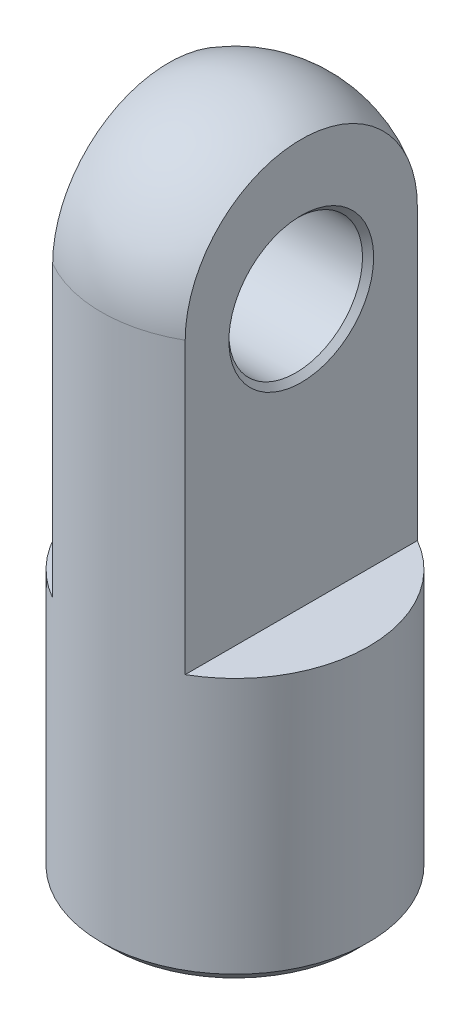
ISO-10303-21;
HEADER;
FILE_DESCRIPTION(('STEP AP214'),'2;1');
FILE_NAME('part.step','',(''),(''),'','','');
FILE_SCHEMA(('AUTOMOTIVE_DESIGN { 1 0 10303 214 1 1 1 1 }'));
ENDSEC;
DATA;
#1=APPLICATION_CONTEXT('core data for automotive mechanical design processes');
#2=APPLICATION_PROTOCOL_DEFINITION('international standard','automotive_design',2000,#1);
#3=PRODUCT_CONTEXT('',#1,'mechanical');
#4=PRODUCT('Part','Part','',(#3));
#5=PRODUCT_RELATED_PRODUCT_CATEGORY('part','',(#4));
#6=PRODUCT_DEFINITION_FORMATION('','',#4);
#7=PRODUCT_DEFINITION_CONTEXT('part definition',#1,'design');
#8=PRODUCT_DEFINITION('design','',#6,#7);
#9=PRODUCT_DEFINITION_SHAPE('','',#8);
#10=(LENGTH_UNIT() NAMED_UNIT(*) SI_UNIT(.MILLI.,.METRE.));
#11=(NAMED_UNIT(*) PLANE_ANGLE_UNIT() SI_UNIT($,.RADIAN.));
#12=(NAMED_UNIT(*) SI_UNIT($,.STERADIAN.) SOLID_ANGLE_UNIT());
#13=UNCERTAINTY_MEASURE_WITH_UNIT(LENGTH_MEASURE(1.E-05),#10,'distance_accuracy_value','');
#14=(GEOMETRIC_REPRESENTATION_CONTEXT(3) GLOBAL_UNCERTAINTY_ASSIGNED_CONTEXT((#13)) GLOBAL_UNIT_ASSIGNED_CONTEXT((#10,
#11,#12)) REPRESENTATION_CONTEXT('',''));
#15=CARTESIAN_POINT('',(0.,0.,0.));
#16=DIRECTION('',(0.,0.,1.));
#17=DIRECTION('',(1.,0.,0.));
#18=AXIS2_PLACEMENT_3D('',#15,#16,#17);
#19=CARTESIAN_POINT('',(0.,-2.5735241580378,0.));
#20=DIRECTION('',(0.,-1.,0.));
#21=DIRECTION('',(0.,0.,-1.));
#22=AXIS2_PLACEMENT_3D('',#19,#20,#21);
#23=CONICAL_SURFACE('',#22,5.32350000003134,1.04719755119985);
#24=CARTESIAN_POINT('',(0.,0.499999999988177,0.));
#25=VERTEX_POINT('',#24);
#26=VERTEX_LOOP('',#25);
#27=FACE_BOUND('',#26,.T.);
#28=CARTESIAN_POINT('',(0.,-2.57352415803097,0.));
#29=DIRECTION('',(0.,-1.,0.));
#30=DIRECTION('',(0.,0.,-1.));
#31=AXIS2_PLACEMENT_3D('',#28,#29,#30);
#32=CIRCLE('',#31,5.3235);
#33=CARTESIAN_POINT('',(0.,-2.57352415803097,-5.3235));
#34=VERTEX_POINT('',#33);
#35=EDGE_CURVE('E68',#34,#34,#32,.T.);
#36=ORIENTED_EDGE('',*,*,#35,.T.);
#37=EDGE_LOOP('',(#36));
#38=FACE_BOUND('',#37,.T.);
#39=ADVANCED_FACE('F15',(#27,#38),#23,.F.);
#40=CARTESIAN_POINT('',(0.,0.5,0.));
#41=DIRECTION('',(0.,-1.,0.));
#42=DIRECTION('',(0.,0.,-1.));
#43=AXIS2_PLACEMENT_3D('',#40,#41,#42);
#44=CYLINDRICAL_SURFACE('',#43,5.3235);
#45=CARTESIAN_POINT('',(0.,-23.3235000000036,0.));
#46=DIRECTION('',(0.,-1.,0.));
#47=DIRECTION('',(0.,0.,-1.));
#48=AXIS2_PLACEMENT_3D('',#45,#46,#47);
#49=CIRCLE('',#48,5.3234999999745);
#50=CARTESIAN_POINT('',(0.,-23.3235000000036,-5.3234999999745));
#51=VERTEX_POINT('',#50);
#52=EDGE_CURVE('E70',#51,#51,#49,.T.);
#53=ORIENTED_EDGE('',*,*,#52,.T.);
#54=EDGE_LOOP('',(#53));
#55=FACE_BOUND('',#54,.T.);
#56=ORIENTED_EDGE('',*,*,#35,.F.);
#57=EDGE_LOOP('',(#56));
#58=FACE_BOUND('',#57,.T.);
#59=ADVANCED_FACE('F65',(#55,#58),#44,.F.);
#60=CARTESIAN_POINT('',(5.95,24.,0.));
#61=DIRECTION('',(-1.,0.,0.));
#62=DIRECTION('',(0.,0.,1.));
#63=AXIS2_PLACEMENT_3D('',#60,#61,#62);
#64=CYLINDRICAL_SURFACE('',#63,6.);
#65=CARTESIAN_POINT('',(-5.45000000005302,24.,0.));
#66=DIRECTION('',(-1.,0.,0.));
#67=DIRECTION('',(0.,0.,1.));
#68=AXIS2_PLACEMENT_3D('',#65,#66,#67);
#69=CIRCLE('',#68,6.00000000002865);
#70=CARTESIAN_POINT('',(-5.45000000005302,24.,6.00000000002865));
#71=VERTEX_POINT('',#70);
#72=EDGE_CURVE('E73',#71,#71,#69,.T.);
#73=ORIENTED_EDGE('',*,*,#72,.T.);
#74=EDGE_LOOP('',(#73));
#75=FACE_BOUND('',#74,.T.);
#76=CARTESIAN_POINT('',(5.45000000005302,24.,0.));
#77=DIRECTION('',(1.,0.,0.));
#78=DIRECTION('',(0.,0.,-1.));
#79=AXIS2_PLACEMENT_3D('',#76,#77,#78);
#80=CIRCLE('',#79,5.99999999991496);
#81=CARTESIAN_POINT('',(5.45000000005302,24.,-5.99999999991496));
#82=VERTEX_POINT('',#81);
#83=EDGE_CURVE('E105',#82,#82,#80,.T.);
#84=ORIENTED_EDGE('',*,*,#83,.T.);
#85=EDGE_LOOP('',(#84));
#86=FACE_BOUND('',#85,.T.);
#87=ADVANCED_FACE('F120',(#75,#86),#64,.F.);
#88=CARTESIAN_POINT('',(0.,-23.9999999999441,0.));
#89=DIRECTION('',(0.,-1.,0.));
#90=DIRECTION('',(0.,0.,-1.));
#91=AXIS2_PLACEMENT_3D('',#88,#89,#90);
#92=CONICAL_SURFACE('',#91,5.99999999997181,0.785398163439461);
#93=CARTESIAN_POINT('',(0.,-24.0000000000009,0.));
#94=DIRECTION('',(0.,-1.,0.));
#95=DIRECTION('',(0.,0.,-1.));
#96=AXIS2_PLACEMENT_3D('',#93,#94,#95);
#97=CIRCLE('',#96,6.00000000002865);
#98=CARTESIAN_POINT('',(0.,-24.0000000000009,-6.00000000002865));
#99=VERTEX_POINT('',#98);
#100=EDGE_CURVE('E18',#99,#99,#97,.T.);
#101=ORIENTED_EDGE('',*,*,#100,.T.);
#102=EDGE_LOOP('',(#101));
#103=FACE_BOUND('',#102,.T.);
#104=ORIENTED_EDGE('',*,*,#52,.F.);
#105=EDGE_LOOP('',(#104));
#106=FACE_BOUND('',#105,.T.);
#107=ADVANCED_FACE('F126',(#103,#106),#92,.F.);
#108=CARTESIAN_POINT('',(-5.94999999992751,24.,0.));
#109=DIRECTION('',(-1.,0.,0.));
#110=DIRECTION('',(0.,0.,1.));
#111=AXIS2_PLACEMENT_3D('',#108,#109,#110);
#112=CONICAL_SURFACE('',#111,6.49999999995998,0.785398163397448);
#113=CARTESIAN_POINT('',(-5.94999999992751,24.,0.));
#114=DIRECTION('',(-1.,0.,0.));
#115=DIRECTION('',(0.,0.,1.));
#116=AXIS2_PLACEMENT_3D('',#113,#114,#115);
#117=CIRCLE('',#116,6.49999999995998);
#118=CARTESIAN_POINT('',(-5.94999999992751,24.,6.49999999995998));
#119=VERTEX_POINT('',#118);
#120=EDGE_CURVE('E98',#119,#119,#117,.F.);
#121=ORIENTED_EDGE('',*,*,#120,.F.);
#122=EDGE_LOOP('',(#121));
#123=FACE_BOUND('',#122,.T.);
#124=ORIENTED_EDGE('',*,*,#72,.F.);
#125=EDGE_LOOP('',(#124));
#126=FACE_BOUND('',#125,.T.);
#127=ADVANCED_FACE('F123',(#123,#126),#112,.F.);
#128=CARTESIAN_POINT('',(5.94999999992751,24.,0.));
#129=DIRECTION('',(1.,0.,0.));
#130=DIRECTION('',(0.,0.,-1.));
#131=AXIS2_PLACEMENT_3D('',#128,#129,#130);
#132=CONICAL_SURFACE('',#131,6.4999999998463,0.785398163397448);
#133=ORIENTED_EDGE('',*,*,#83,.F.);
#134=EDGE_LOOP('',(#133));
#135=FACE_BOUND('',#134,.T.);
#136=CARTESIAN_POINT('',(5.94999999998436,24.,0.));
#137=DIRECTION('',(1.,0.,0.));
#138=DIRECTION('',(0.,0.,-1.));
#139=AXIS2_PLACEMENT_3D('',#136,#137,#138);
#140=CIRCLE('',#139,6.49999999990314);
#141=CARTESIAN_POINT('',(5.94999999998436,24.,-6.49999999990314));
#142=VERTEX_POINT('',#141);
#143=EDGE_CURVE('E95',#142,#142,#140,.F.);
#144=ORIENTED_EDGE('',*,*,#143,.F.);
#145=EDGE_LOOP('',(#144));
#146=FACE_BOUND('',#145,.T.);
#147=ADVANCED_FACE('F125',(#135,#146),#132,.F.);
#148=CARTESIAN_POINT('',(0.,-24.,0.));
#149=DIRECTION('',(0.,1.,0.));
#150=DIRECTION('',(0.,0.,1.));
#151=AXIS2_PLACEMENT_3D('',#148,#149,#150);
#152=PLANE('',#151);
#153=ORIENTED_EDGE('',*,*,#100,.F.);
#154=EDGE_LOOP('',(#153));
#155=FACE_BOUND('',#154,.T.);
#156=CARTESIAN_POINT('',(0.,-24.,0.));
#157=DIRECTION('',(0.,1.,0.));
#158=DIRECTION('',(0.,0.,1.));
#159=AXIS2_PLACEMENT_3D('',#156,#157,#158);
#160=CIRCLE('',#159,11.);
#161=CARTESIAN_POINT('',(0.,-24.,11.));
#162=VERTEX_POINT('',#161);
#163=EDGE_CURVE('E90',#162,#162,#160,.T.);
#164=ORIENTED_EDGE('',*,*,#163,.F.);
#165=EDGE_LOOP('',(#164));
#166=FACE_BOUND('',#165,.T.);
#167=ADVANCED_FACE('F134',(#155,#166),#152,.F.);
#168=CARTESIAN_POINT('',(-12.,0.,12.));
#169=DIRECTION('',(0.,1.,0.));
#170=DIRECTION('',(0.,0.,1.));
#171=AXIS2_PLACEMENT_3D('',#168,#169,#170);
#172=PLANE('',#171);
#173=CARTESIAN_POINT('',(0.,0.,0.));
#174=DIRECTION('',(0.,-1.,0.));
#175=DIRECTION('',(0.,0.,-1.));
#176=AXIS2_PLACEMENT_3D('',#173,#174,#175);
#177=CIRCLE('',#176,12.);
#178=CARTESIAN_POINT('',(-5.95000000000001,0.,10.421012426823));
#179=VERTEX_POINT('',#178);
#180=CARTESIAN_POINT('',(-5.95000000000001,0.,-10.421012426823));
#181=VERTEX_POINT('',#180);
#182=EDGE_CURVE('E85',#179,#181,#177,.T.);
#183=ORIENTED_EDGE('',*,*,#182,.F.);
#184=DIRECTION('',(0.,0.,1.));
#185=VECTOR('',#184,1.);
#186=CARTESIAN_POINT('',(-5.95,0.,12.));
#187=LINE('',#186,#185);
#188=EDGE_CURVE('E56',#181,#179,#187,.T.);
#189=ORIENTED_EDGE('',*,*,#188,.F.);
#190=EDGE_LOOP('',(#183,#189));
#191=FACE_BOUND('',#190,.T.);
#192=ADVANCED_FACE('F173',(#191),#172,.T.);
#193=CARTESIAN_POINT('',(-5.95,0.,12.));
#194=DIRECTION('',(-1.,0.,0.));
#195=DIRECTION('',(0.,0.,1.));
#196=AXIS2_PLACEMENT_3D('',#193,#194,#195);
#197=PLANE('',#196);
#198=ORIENTED_EDGE('',*,*,#120,.T.);
#199=EDGE_LOOP('',(#198));
#200=FACE_BOUND('',#199,.T.);
#201=DIRECTION('',(0.,-1.,0.));
#202=VECTOR('',#201,1.);
#203=CARTESIAN_POINT('',(-5.95000000000002,38.,-10.421012426823));
#204=LINE('',#203,#202);
#205=CARTESIAN_POINT('',(-5.95000000000001,26.,-10.421012426823));
#206=VERTEX_POINT('',#205);
#207=EDGE_CURVE('E88',#181,#206,#204,.F.);
#208=ORIENTED_EDGE('',*,*,#207,.F.);
#209=ORIENTED_EDGE('',*,*,#188,.T.);
#210=DIRECTION('',(0.,-1.,0.));
#211=VECTOR('',#210,1.);
#212=CARTESIAN_POINT('',(-5.95000000000001,38.,10.421012426823));
#213=LINE('',#212,#211);
#214=CARTESIAN_POINT('',(-5.95000000000001,26.,10.421012426823));
#215=VERTEX_POINT('',#214);
#216=EDGE_CURVE('E89',#215,#179,#213,.T.);
#217=ORIENTED_EDGE('',*,*,#216,.F.);
#218=CARTESIAN_POINT('',(-5.95,26.,0.));
#219=DIRECTION('',(1.,0.,0.));
#220=DIRECTION('',(0.,0.,-1.));
#221=AXIS2_PLACEMENT_3D('',#218,#219,#220);
#222=CIRCLE('',#221,10.421012426823);
#223=EDGE_CURVE('E49',#206,#215,#222,.T.);
#224=ORIENTED_EDGE('',*,*,#223,.F.);
#225=EDGE_LOOP('',(#208,#209,#217,#224));
#226=FACE_BOUND('',#225,.T.);
#227=ADVANCED_FACE('F170',(#200,#226),#197,.T.);
#228=CARTESIAN_POINT('',(5.95,0.,12.));
#229=DIRECTION('',(0.,1.,0.));
#230=DIRECTION('',(0.,0.,1.));
#231=AXIS2_PLACEMENT_3D('',#228,#229,#230);
#232=PLANE('',#231);
#233=DIRECTION('',(0.,0.,-1.));
#234=VECTOR('',#233,1.);
#235=CARTESIAN_POINT('',(5.95,0.,12.));
#236=LINE('',#235,#234);
#237=CARTESIAN_POINT('',(5.95000000000001,0.,10.421012426823));
#238=VERTEX_POINT('',#237);
#239=CARTESIAN_POINT('',(5.95000000000001,0.,-10.421012426823));
#240=VERTEX_POINT('',#239);
#241=EDGE_CURVE('E97',#238,#240,#236,.T.);
#242=ORIENTED_EDGE('',*,*,#241,.F.);
#243=CARTESIAN_POINT('',(0.,0.,0.));
#244=DIRECTION('',(0.,-1.,0.));
#245=DIRECTION('',(0.,0.,-1.));
#246=AXIS2_PLACEMENT_3D('',#243,#244,#245);
#247=CIRCLE('',#246,12.);
#248=EDGE_CURVE('E80',#240,#238,#247,.T.);
#249=ORIENTED_EDGE('',*,*,#248,.F.);
#250=EDGE_LOOP('',(#242,#249));
#251=FACE_BOUND('',#250,.T.);
#252=ADVANCED_FACE('F172',(#251),#232,.T.);
#253=CARTESIAN_POINT('',(5.95,36.421012426823,12.));
#254=DIRECTION('',(1.,0.,0.));
#255=DIRECTION('',(0.,0.,-1.));
#256=AXIS2_PLACEMENT_3D('',#253,#254,#255);
#257=PLANE('',#256);
#258=ORIENTED_EDGE('',*,*,#143,.T.);
#259=EDGE_LOOP('',(#258));
#260=FACE_BOUND('',#259,.T.);
#261=DIRECTION('',(0.,-1.,0.));
#262=VECTOR('',#261,1.);
#263=CARTESIAN_POINT('',(5.95000000000001,38.,10.421012426823));
#264=LINE('',#263,#262);
#265=CARTESIAN_POINT('',(5.95000000000001,26.,10.421012426823));
#266=VERTEX_POINT('',#265);
#267=EDGE_CURVE('E83',#238,#266,#264,.F.);
#268=ORIENTED_EDGE('',*,*,#267,.F.);
#269=ORIENTED_EDGE('',*,*,#241,.T.);
#270=DIRECTION('',(0.,-1.,0.));
#271=VECTOR('',#270,1.);
#272=CARTESIAN_POINT('',(5.95000000000001,38.,-10.421012426823));
#273=LINE('',#272,#271);
#274=CARTESIAN_POINT('',(5.95000000000001,26.,-10.421012426823));
#275=VERTEX_POINT('',#274);
#276=EDGE_CURVE('E84',#275,#240,#273,.T.);
#277=ORIENTED_EDGE('',*,*,#276,.F.);
#278=CARTESIAN_POINT('',(5.95,26.,0.));
#279=DIRECTION('',(1.,0.,0.));
#280=DIRECTION('',(0.,0.,-1.));
#281=AXIS2_PLACEMENT_3D('',#278,#279,#280);
#282=CIRCLE('',#281,10.421012426823);
#283=EDGE_CURVE('E33',#266,#275,#282,.F.);
#284=ORIENTED_EDGE('',*,*,#283,.F.);
#285=EDGE_LOOP('',(#268,#269,#277,#284));
#286=FACE_BOUND('',#285,.T.);
#287=ADVANCED_FACE('F155',(#260,#286),#257,.T.);
#288=CARTESIAN_POINT('',(0.,26.,0.));
#289=DIRECTION('',(1.,0.,0.));
#290=DIRECTION('',(0.,0.,-1.));
#291=AXIS2_PLACEMENT_3D('',#288,#289,#290);
#292=SPHERICAL_SURFACE('',#291,12.);
#293=CARTESIAN_POINT('',(0.,26.,0.));
#294=DIRECTION('',(0.,-1.,0.));
#295=DIRECTION('',(0.,0.,-1.));
#296=AXIS2_PLACEMENT_3D('',#293,#294,#295);
#297=CIRCLE('',#296,12.);
#298=EDGE_CURVE('E24',#266,#215,#297,.T.);
#299=ORIENTED_EDGE('',*,*,#298,.F.);
#300=ORIENTED_EDGE('',*,*,#283,.T.);
#301=CARTESIAN_POINT('',(0.,26.,0.));
#302=DIRECTION('',(0.,-1.,0.));
#303=DIRECTION('',(0.,0.,-1.));
#304=AXIS2_PLACEMENT_3D('',#301,#302,#303);
#305=CIRCLE('',#304,12.);
#306=EDGE_CURVE('E167',#206,#275,#305,.T.);
#307=ORIENTED_EDGE('',*,*,#306,.F.);
#308=ORIENTED_EDGE('',*,*,#223,.T.);
#309=EDGE_LOOP('',(#299,#300,#307,#308));
#310=FACE_BOUND('',#309,.T.);
#311=ADVANCED_FACE('F147',(#310),#292,.T.);
#312=CARTESIAN_POINT('',(0.,-23.,0.));
#313=DIRECTION('',(0.,1.,0.));
#314=DIRECTION('',(0.,0.,1.));
#315=AXIS2_PLACEMENT_3D('',#312,#313,#314);
#316=CONICAL_SURFACE('',#315,12.,0.785398163397448);
#317=ORIENTED_EDGE('',*,*,#163,.T.);
#318=EDGE_LOOP('',(#317));
#319=FACE_BOUND('',#318,.T.);
#320=CARTESIAN_POINT('',(0.,-23.,0.));
#321=DIRECTION('',(0.,-1.,0.));
#322=DIRECTION('',(0.,0.,-1.));
#323=AXIS2_PLACEMENT_3D('',#320,#321,#322);
#324=CIRCLE('',#323,12.);
#325=CARTESIAN_POINT('',(0.,-23.,-12.));
#326=VERTEX_POINT('',#325);
#327=EDGE_CURVE('E9',#326,#326,#324,.F.);
#328=ORIENTED_EDGE('',*,*,#327,.F.);
#329=EDGE_LOOP('',(#328));
#330=FACE_BOUND('',#329,.T.);
#331=ADVANCED_FACE('F141',(#319,#330),#316,.T.);
#332=CARTESIAN_POINT('',(0.,38.,0.));
#333=DIRECTION('',(0.,-1.,0.));
#334=DIRECTION('',(0.,0.,-1.));
#335=AXIS2_PLACEMENT_3D('',#332,#333,#334);
#336=CYLINDRICAL_SURFACE('',#335,12.);
#337=ORIENTED_EDGE('',*,*,#327,.T.);
#338=EDGE_LOOP('',(#337));
#339=FACE_BOUND('',#338,.T.);
#340=ORIENTED_EDGE('',*,*,#267,.T.);
#341=ORIENTED_EDGE('',*,*,#298,.T.);
#342=ORIENTED_EDGE('',*,*,#216,.T.);
#343=ORIENTED_EDGE('',*,*,#182,.T.);
#344=ORIENTED_EDGE('',*,*,#207,.T.);
#345=ORIENTED_EDGE('',*,*,#306,.T.);
#346=ORIENTED_EDGE('',*,*,#276,.T.);
#347=ORIENTED_EDGE('',*,*,#248,.T.);
#348=EDGE_LOOP('',(#340,#341,#342,#343,#344,#345,#346,#347));
#349=FACE_BOUND('',#348,.T.);
#350=ADVANCED_FACE('F139',(#339,#349),#336,.T.);
#351=CLOSED_SHELL('',(#39,#59,#87,#107,#127,#147,#167,#192,#227,#252,#287,#311,#331,#350));
#352=MANIFOLD_SOLID_BREP('B1',#351);
#353=ADVANCED_BREP_SHAPE_REPRESENTATION('',(#18,#352),#14);
#354=SHAPE_DEFINITION_REPRESENTATION(#9,#353);
ENDSEC;
END-ISO-10303-21;
